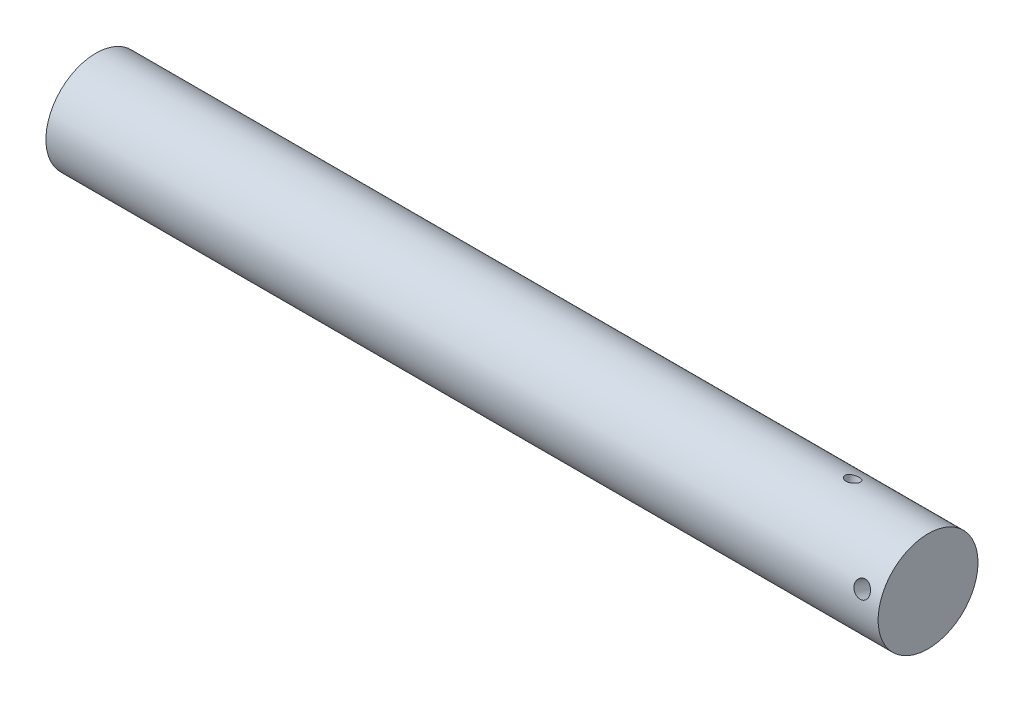
ISO-10303-21;
HEADER;
FILE_DESCRIPTION(('STEP AP214'),'2;1');
FILE_NAME('part.step','',(''),(''),'','','');
FILE_SCHEMA(('AUTOMOTIVE_DESIGN { 1 0 10303 214 1 1 1 1 }'));
ENDSEC;
DATA;
#1=APPLICATION_CONTEXT('core data for automotive mechanical design processes');
#2=APPLICATION_PROTOCOL_DEFINITION('international standard','automotive_design',2000,#1);
#3=PRODUCT_CONTEXT('',#1,'mechanical');
#4=PRODUCT('Part','Part','',(#3));
#5=PRODUCT_RELATED_PRODUCT_CATEGORY('part','',(#4));
#6=PRODUCT_DEFINITION_FORMATION('','',#4);
#7=PRODUCT_DEFINITION_CONTEXT('part definition',#1,'design');
#8=PRODUCT_DEFINITION('design','',#6,#7);
#9=PRODUCT_DEFINITION_SHAPE('','',#8);
#10=(LENGTH_UNIT() NAMED_UNIT(*) SI_UNIT(.MILLI.,.METRE.));
#11=(NAMED_UNIT(*) PLANE_ANGLE_UNIT() SI_UNIT($,.RADIAN.));
#12=(NAMED_UNIT(*) SI_UNIT($,.STERADIAN.) SOLID_ANGLE_UNIT());
#13=UNCERTAINTY_MEASURE_WITH_UNIT(LENGTH_MEASURE(1.E-05),#10,'distance_accuracy_value','');
#14=(GEOMETRIC_REPRESENTATION_CONTEXT(3) GLOBAL_UNCERTAINTY_ASSIGNED_CONTEXT((#13)) GLOBAL_UNIT_ASSIGNED_CONTEXT((#10,
#11,#12)) REPRESENTATION_CONTEXT('',''));
#15=CARTESIAN_POINT('',(0.,0.,0.));
#16=DIRECTION('',(0.,0.,1.));
#17=DIRECTION('',(1.,0.,0.));
#18=AXIS2_PLACEMENT_3D('',#15,#16,#17);
#19=CARTESIAN_POINT('',(125.,0.,0.));
#20=DIRECTION('',(-1.,0.,0.));
#21=DIRECTION('',(0.,0.,1.));
#22=AXIS2_PLACEMENT_3D('',#19,#20,#21);
#23=CYLINDRICAL_SURFACE('',#22,7.5);
#24=CARTESIAN_POINT('',(112.009618943233,-7.02552221836466,2.62526904511986));
#25=CARTESIAN_POINT('',(112.065520870964,-7.02552356947253,2.62526693540636));
#26=CARTESIAN_POINT('',(112.12145695978,-7.02718796542101,2.6208245782744));
#27=CARTESIAN_POINT('',(112.23177017439,-7.03374925218367,2.60316284386426));
#28=CARTESIAN_POINT('',(112.28614564569,-7.03864945029205,2.58993448638676));
#29=CARTESIAN_POINT('',(112.39172462735,-7.05138188389406,2.55506473660845));
#30=CARTESIAN_POINT('',(112.442930349043,-7.05921204784794,2.53342928786123));
#31=CARTESIAN_POINT('',(112.540774481087,-7.0773455533345,2.48231982767184));
#32=CARTESIAN_POINT('',(112.587413622702,-7.08764849797638,2.45284707406535));
#33=CARTESIAN_POINT('',(112.675105670568,-7.11021832316173,2.38663406841461));
#34=CARTESIAN_POINT('',(112.716125376073,-7.12249601626738,2.34985352611347));
#35=CARTESIAN_POINT('',(112.791127065962,-7.14832013832273,2.27008221844144));
#36=CARTESIAN_POINT('',(112.825108688971,-7.16186663236768,2.2270911343801));
#37=CARTESIAN_POINT('',(112.885189864092,-7.18960542180866,2.13584937449103));
#38=CARTESIAN_POINT('',(112.911259187879,-7.20379996134059,2.08757946287503));
#39=CARTESIAN_POINT('',(112.954582025324,-7.2321286663056,1.98721680913991));
#40=CARTESIAN_POINT('',(112.971835909422,-7.24626283425084,1.93512422776123));
#41=CARTESIAN_POINT('',(112.996938398024,-7.27380087891752,1.82888293084838));
#42=CARTESIAN_POINT('',(113.004842350739,-7.28720860034206,1.7747482928307));
#43=CARTESIAN_POINT('',(113.011192247602,-7.31291253438508,1.66566779412532));
#44=CARTESIAN_POINT('',(113.009638612102,-7.32520879637899,1.61072196960001));
#45=CARTESIAN_POINT('',(112.997161577963,-7.34827968836436,1.50195144663563));
#46=CARTESIAN_POINT('',(112.986297710861,-7.35906348067012,1.44812184591167));
#47=CARTESIAN_POINT('',(112.955601779723,-7.37901377963603,1.3427702461798));
#48=CARTESIAN_POINT('',(112.935769525649,-7.38818025201987,1.29124829609581));
#49=CARTESIAN_POINT('',(112.887637222672,-7.40486791474347,1.19183969599047));
#50=CARTESIAN_POINT('',(112.859311631642,-7.4123840221135,1.143964565533));
#51=CARTESIAN_POINT('',(112.795015314592,-7.42579591910018,1.05340113768405));
#52=CARTESIAN_POINT('',(112.75904418992,-7.43169162418909,1.01071311094089));
#53=CARTESIAN_POINT('',(112.680145019054,-7.4420429582459,0.931455708003939));
#54=CARTESIAN_POINT('',(112.637165059137,-7.4464870346691,0.894936482860358));
#55=CARTESIAN_POINT('',(112.545645977547,-7.45405814853691,0.829520894359403));
#56=CARTESIAN_POINT('',(112.497106833832,-7.457185180759,0.800624561229554));
#57=CARTESIAN_POINT('',(112.39579894306,-7.46231291816655,0.751334355624638));
#58=CARTESIAN_POINT('',(112.343027990974,-7.4643130317453,0.730944950548513));
#59=CARTESIAN_POINT('',(112.234779932914,-7.46734037570035,0.699344015170887));
#60=CARTESIAN_POINT('',(112.17930297622,-7.46836765968028,0.688131979194308));
#61=CARTESIAN_POINT('',(112.067673275731,-7.46953877038617,0.675301729632604));
#62=CARTESIAN_POINT('',(112.011528978067,-7.46968931233832,0.673610595983552));
#63=CARTESIAN_POINT('',(111.899759315181,-7.4691392877154,0.679681709853656));
#64=CARTESIAN_POINT('',(111.844133937364,-7.46843874185209,0.687443727324551));
#65=CARTESIAN_POINT('',(111.735200950031,-7.46612594429184,0.712119652047882));
#66=CARTESIAN_POINT('',(111.681885196724,-7.46451723485037,0.728997990463441));
#67=CARTESIAN_POINT('',(111.578829486507,-7.46025932779922,0.771350155379572));
#68=CARTESIAN_POINT('',(111.529089671572,-7.45761008890443,0.796824322931501));
#69=CARTESIAN_POINT('',(111.434270288013,-7.4510768808594,0.855765411222552));
#70=CARTESIAN_POINT('',(111.389220419049,-7.44718561070376,0.889279294704683));
#71=CARTESIAN_POINT('',(111.305363474015,-7.43798393611729,0.963212962765682));
#72=CARTESIAN_POINT('',(111.266556675159,-7.43267346869675,1.0036330538413));
#73=CARTESIAN_POINT('',(111.196030666273,-7.42043064233704,1.09047732995043));
#74=CARTESIAN_POINT('',(111.164359285048,-7.41348794095144,1.13693892034527));
#75=CARTESIAN_POINT('',(111.109334802146,-7.39790168985616,1.23429223784641));
#76=CARTESIAN_POINT('',(111.085981513355,-7.38925817841264,1.28518386526789));
#77=CARTESIAN_POINT('',(111.048334312439,-7.37030667977734,1.38974515008643));
#78=CARTESIAN_POINT('',(111.034013228692,-7.36000380300391,1.44340594492904));
#79=CARTESIAN_POINT('',(111.014748700503,-7.33785636844531,1.5520750483158));
#80=CARTESIAN_POINT('',(111.00980477188,-7.32601189029333,1.60708328713712));
#81=CARTESIAN_POINT('',(111.009444809613,-7.30116601035018,1.7164189086748));
#82=CARTESIAN_POINT('',(111.013955207936,-7.28817428950088,1.77074826366084));
#83=CARTESIAN_POINT('',(111.032219463849,-7.26137541750468,1.87762169064797));
#84=CARTESIAN_POINT('',(111.045973308494,-7.24756826749982,1.93016576514926));
#85=CARTESIAN_POINT('',(111.082309966772,-7.21967958588964,2.03199772805979));
#86=CARTESIAN_POINT('',(111.104888756437,-7.20559818211422,2.08128708858514));
#87=CARTESIAN_POINT('',(111.158226718056,-7.17776966930051,2.17532297721661));
#88=CARTESIAN_POINT('',(111.18898604106,-7.16402256644008,2.22006942141855));
#89=CARTESIAN_POINT('',(111.258082284235,-7.13741934589667,2.30417188333964));
#90=CARTESIAN_POINT('',(111.296473838303,-7.12457061181955,2.34348535410143));
#91=CARTESIAN_POINT('',(111.379630477757,-7.10054194180106,2.41531416246733));
#92=CARTESIAN_POINT('',(111.424397065194,-7.08936240042103,2.44782789348432));
#93=CARTESIAN_POINT('',(111.519260914019,-7.06924814382793,2.50532741403493));
#94=CARTESIAN_POINT('',(111.569380738988,-7.06032351056174,2.53027949025778));
#95=CARTESIAN_POINT('',(111.673343176992,-7.04531477296633,2.57177584366941));
#96=CARTESIAN_POINT('',(111.727181728113,-7.03922762391203,2.58832913475961));
#97=CARTESIAN_POINT('',(111.819343082596,-7.03169531674179,2.60870353983615));
#98=CARTESIAN_POINT('',(111.857088079717,-7.02938689253783,2.61490719940593));
#99=CARTESIAN_POINT('',(111.933089697969,-7.02629988781076,2.62319065545004));
#100=CARTESIAN_POINT('',(111.971346314433,-7.02552129334378,2.62527048951158));
#101=CARTESIAN_POINT('',(112.009618943233,-7.02552221836466,2.62526904511986));
#102=B_SPLINE_CURVE_WITH_KNOTS('',3,(#24,#25,#26,#27,#28,#29,#30,#31,#32,#33,#34,#35,#36,#37,
#38,#39,#40,#41,#42,#43,#44,#45,#46,#47,#48,#49,#50,#51,#52,#53,#54,#55,#56,#57,#58,#59,#60,#61,
#62,#63,#64,#65,#66,#67,#68,#69,#70,#71,#72,#73,#74,#75,#76,#77,#78,#79,#80,#81,#82,#83,#84,#85,
#86,#87,#88,#89,#90,#91,#92,#93,#94,#95,#96,#97,#98,#99,#100,#101),.UNSPECIFIED.,.T.,.F.,(4,2,2,
2,2,2,2,2,2,2,2,2,2,2,2,2,2,2,2,2,2,2,2,2,2,2,2,2,2,2,2,2,2,2,2,2,2,2,4),(0.,0.167565944619552,
0.335303423041822,0.502922531373102,0.67051475416376,0.839057975594798,1.00760984880016,
1.17679778261471,1.34597860627362,1.51415284761382,1.68231961431326,1.84941904333875,
2.01652201332238,2.18413264227024,2.35175201291213,2.52067457533378,2.68959780758443,
2.85860963826769,3.0276121557345,3.19531851289863,3.36302078890669,3.53007342408195,
3.69713268808003,3.86519264070065,4.03326005374209,4.2024225588115,4.37158125836474,
4.54022861884066,4.70886727109972,4.87619854927048,5.04352959309219,5.21078442673996,
5.37804234889437,5.54654371183371,5.715084842036,5.88436670989948,6.05346651155518,
6.16818970471025,6.28291185219903),.UNSPECIFIED.);
#103=CARTESIAN_POINT('',(112.009618943233,-7.02552221836466,2.62526904511986));
#104=VERTEX_POINT('',#103);
#105=EDGE_CURVE('E35',#104,#104,#102,.T.);
#106=ORIENTED_EDGE('',*,*,#105,.T.);
#107=EDGE_LOOP('',(#106));
#108=FACE_BOUND('',#107,.T.);
#109=CARTESIAN_POINT('',(112.009618943233,7.46954685246652,-0.675181322910747));
#110=CARTESIAN_POINT('',(111.953717015503,7.46954715699688,-0.675183809604297));
#111=CARTESIAN_POINT('',(111.897780926687,7.46912418894381,-0.67990883328543));
#112=CARTESIAN_POINT('',(111.787467712076,7.46739213802689,-0.698670159090852));
#113=CARTESIAN_POINT('',(111.733092240777,7.46608214850882,-0.712715988027464));
#114=CARTESIAN_POINT('',(111.627513259116,7.46246280103809,-0.74966073919617));
#115=CARTESIAN_POINT('',(111.576307537424,7.46015414897872,-0.772553406924217));
#116=CARTESIAN_POINT('',(111.47846340538,7.45437256450153,-0.82647533403198));
#117=CARTESIAN_POINT('',(111.431824263765,7.45089981888976,-0.85750328774083));
#118=CARTESIAN_POINT('',(111.344132215899,7.44257824468882,-0.926960544590068));
#119=CARTESIAN_POINT('',(111.303112510394,7.43772171936636,-0.965430847445059));
#120=CARTESIAN_POINT('',(111.228110820505,7.42646365826135,-1.04851876995965));
#121=CARTESIAN_POINT('',(111.194129197495,7.42006204318207,-1.0931367050761));
#122=CARTESIAN_POINT('',(111.134048022375,7.40556384592879,-1.18739327759872));
#123=CARTESIAN_POINT('',(111.107978698588,7.39746095865676,-1.23705022613361));
#124=CARTESIAN_POINT('',(111.064655861143,7.37954569203472,-1.33978396456267));
#125=CARTESIAN_POINT('',(111.047401977045,7.36973338454073,-1.39286061064965));
#126=CARTESIAN_POINT('',(111.022299488443,7.34856027975742,-1.50055117062415));
#127=CARTESIAN_POINT('',(111.014395535727,7.3372090429336,-1.55515405928101));
#128=CARTESIAN_POINT('',(111.008045638865,7.31315341826052,-1.66460986928985));
#129=CARTESIAN_POINT('',(111.009599274365,7.30044909057559,-1.71946277942106));
#130=CARTESIAN_POINT('',(111.022076308504,7.27415418831446,-1.82749921234081));
#131=CARTESIAN_POINT('',(111.032940175606,7.26056975042902,-1.88069112091656));
#132=CARTESIAN_POINT('',(111.063636106744,7.23294208046257,-1.9842946239805));
#133=CARTESIAN_POINT('',(111.083468360817,7.21889883866548,-2.03470615952791));
#134=CARTESIAN_POINT('',(111.131600663794,7.1909031426932,-2.13153998042283));
#135=CARTESIAN_POINT('',(111.159926254825,7.17695109394227,-2.17794968115414));
#136=CARTESIAN_POINT('',(111.224222571875,7.14983201351875,-2.26539205601619));
#137=CARTESIAN_POINT('',(111.260193696547,7.13666502282651,-2.30642444958311));
#138=CARTESIAN_POINT('',(111.339092867413,7.11168195644076,-2.38235028465281));
#139=CARTESIAN_POINT('',(111.38207282733,7.09987717961104,-2.41719351734358));
#140=CARTESIAN_POINT('',(111.47359190892,7.07838068769002,-2.47943837110046));
#141=CARTESIAN_POINT('',(111.522131052635,7.06868898097784,-2.50683996265778));
#142=CARTESIAN_POINT('',(111.623438943407,7.05197135766039,-2.55349121269582));
#143=CARTESIAN_POINT('',(111.676209895493,7.04494684189966,-2.57273658803675));
#144=CARTESIAN_POINT('',(111.784457953553,7.03399433413782,-2.60253300563837));
#145=CARTESIAN_POINT('',(111.839934910247,7.03006617152739,-2.61308452693255));
#146=CARTESIAN_POINT('',(111.951564610736,7.02556706231403,-2.62515700888065));
#147=CARTESIAN_POINT('',(112.0077089084,7.02497059869016,-2.62674660852953));
#148=CARTESIAN_POINT('',(112.119478571286,7.02710324415969,-2.62103584903443));
#149=CARTESIAN_POINT('',(112.175103949103,7.02983227232519,-2.61373570622781));
#150=CARTESIAN_POINT('',(112.284036936436,7.0384307489509,-2.59049099729818));
#151=CARTESIAN_POINT('',(112.337352689742,7.04428799117828,-2.57458002727034));
#152=CARTESIAN_POINT('',(112.44040839996,7.05878591832455,-2.53455946063266));
#153=CARTESIAN_POINT('',(112.490148214895,7.06742671368411,-2.51044953871782));
#154=CARTESIAN_POINT('',(112.584967598454,7.08705570303375,-2.45449029039009));
#155=CARTESIAN_POINT('',(112.630017467418,7.09805764795779,-2.42259546984871));
#156=CARTESIAN_POINT('',(112.713874412452,7.12177216522789,-2.35196629911314));
#157=CARTESIAN_POINT('',(112.752681211307,7.13448481348947,-2.31323164536532));
#158=CARTESIAN_POINT('',(112.823207220194,7.16104753625159,-2.22964793373647));
#159=CARTESIAN_POINT('',(112.854878601419,7.17490448226091,-2.18476068018));
#160=CARTESIAN_POINT('',(112.909903084321,7.20300319264194,-2.09025638331152));
#161=CARTESIAN_POINT('',(112.933256373111,7.21724494834968,-2.04063944642459));
#162=CARTESIAN_POINT('',(112.970903574027,7.24543079627136,-1.93818077397386));
#163=CARTESIAN_POINT('',(112.985224657775,7.25937565813873,-1.8853492398257));
#164=CARTESIAN_POINT('',(113.004489185964,7.28645907542809,-1.77780403353393));
#165=CARTESIAN_POINT('',(113.009433114587,7.29959767244706,-1.72309045871661));
#166=CARTESIAN_POINT('',(113.009793076854,7.32453721892855,-1.61377616455306));
#167=CARTESIAN_POINT('',(113.005282678531,7.33634774887731,-1.55917785866217));
#168=CARTESIAN_POINT('',(112.987018422617,7.35846083607718,-1.45123750332306));
#169=CARTESIAN_POINT('',(112.973264577973,7.3687633954402,-1.39789545211554));
#170=CARTESIAN_POINT('',(112.936927919695,7.38771143622979,-1.29402775269748));
#171=CARTESIAN_POINT('',(112.914349130029,7.39635767022803,-1.24350083283359));
#172=CARTESIAN_POINT('',(112.861011168411,7.41198468880285,-1.14668672866175));
#173=CARTESIAN_POINT('',(112.830251845407,7.4189654426225,-1.10039962266146));
#174=CARTESIAN_POINT('',(112.761155602232,7.43139635299305,-1.013070200862));
#175=CARTESIAN_POINT('',(112.722764048164,7.43683474485342,-0.972069434470431));
#176=CARTESIAN_POINT('',(112.63960740871,7.44627261084255,-0.896918377394076));
#177=CARTESIAN_POINT('',(112.594840821273,7.45027174507578,-0.862769705743512));
#178=CARTESIAN_POINT('',(112.499976972448,7.45703437384413,-0.80223009033356));
#179=CARTESIAN_POINT('',(112.449857147478,7.45979236049998,-0.775873901375876));
#180=CARTESIAN_POINT('',(112.345894709475,7.4642287445353,-0.731970279118003));
#181=CARTESIAN_POINT('',(112.292056158354,7.46590829984545,-0.714413402303315));
#182=CARTESIAN_POINT('',(112.199894803871,7.46793948563065,-0.692786421056829));
#183=CARTESIAN_POINT('',(112.16214980675,7.46854445748043,-0.686194894418478));
#184=CARTESIAN_POINT('',(112.086148188498,7.46934803479979,-0.677391514061398));
#185=CARTESIAN_POINT('',(112.047891572034,7.46954664397322,-0.675179620423856));
#186=CARTESIAN_POINT('',(112.009618943233,7.46954685246652,-0.675181322910747));
#187=B_SPLINE_CURVE_WITH_KNOTS('',3,(#109,#110,#111,#112,#113,#114,#115,#116,#117,#118,#119,
#120,#121,#122,#123,#124,#125,#126,#127,#128,#129,#130,#131,#132,#133,#134,#135,#136,#137,#138,
#139,#140,#141,#142,#143,#144,#145,#146,#147,#148,#149,#150,#151,#152,#153,#154,#155,#156,#157,
#158,#159,#160,#161,#162,#163,#164,#165,#166,#167,#168,#169,#170,#171,#172,#173,#174,#175,#176,
#177,#178,#179,#180,#181,#182,#183,#184,#185,#186),.UNSPECIFIED.,.T.,.F.,(4,2,2,2,2,2,2,2,2,2,2,
2,2,2,2,2,2,2,2,2,2,2,2,2,2,2,2,2,2,2,2,2,2,2,2,2,2,2,4),(0.,0.167565944619552,
0.335303423041822,0.502922531373099,0.670514754163762,0.839057975594799,1.00760984880016,
1.17679778261471,1.34597860627362,1.51415284761383,1.68231961431326,1.84941904333875,
2.01652201332238,2.18413264227024,2.35175201291213,2.52067457533378,2.68959780758443,
2.85860963826769,3.02761215573451,3.19531851289863,3.36302078890669,3.53007342408195,
3.69713268808004,3.86519264070066,4.03326005374209,4.2024225588115,4.37158125836474,
4.54022861884066,4.70886727109972,4.87619854927049,5.04352959309219,5.21078442673996,
5.37804234889438,5.54654371183371,5.715084842036,5.88436670989948,6.05346651155518,
6.16818970471026,6.28291185219903),.UNSPECIFIED.);
#188=CARTESIAN_POINT('',(112.009618943233,7.46954685246652,-0.675181322910747));
#189=VERTEX_POINT('',#188);
#190=EDGE_CURVE('E10',#189,#189,#187,.T.);
#191=ORIENTED_EDGE('',*,*,#190,.T.);
#192=EDGE_LOOP('',(#191));
#193=FACE_BOUND('',#192,.T.);
#194=CARTESIAN_POINT('',(122.197095895973,3.51335032442327,6.62618815744579));
#195=CARTESIAN_POINT('',(122.26352015471,3.51334813526074,6.62619012687177));
#196=CARTESIAN_POINT('',(122.329981803081,3.50836153272444,6.6288407612117));
#197=CARTESIAN_POINT('',(122.461043525227,3.48852964538728,6.63929828979605));
#198=CARTESIAN_POINT('',(122.525641773319,3.47367501318495,6.64711007285346));
#199=CARTESIAN_POINT('',(122.651060810878,3.4344936718587,6.66743856478263));
#200=CARTESIAN_POINT('',(122.711884586016,3.41017456294396,6.67995149823575));
#201=CARTESIAN_POINT('',(122.828121878438,3.35266460785247,6.70899940733286));
#202=CARTESIAN_POINT('',(122.883536069514,3.31947486848798,6.72553388117538));
#203=CARTESIAN_POINT('',(122.987884898245,3.24471471357652,6.76192010993685));
#204=CARTESIAN_POINT('',(123.03676407553,3.20307929425614,6.78179737698481));
#205=CARTESIAN_POINT('',(123.126174196815,3.1125964566457,6.8237985236622));
#206=CARTESIAN_POINT('',(123.166704663727,3.06374862647446,6.84592253157435));
#207=CARTESIAN_POINT('',(123.238473328537,2.95975877682916,6.89152113898285));
#208=CARTESIAN_POINT('',(123.269660169591,2.90458419507704,6.91500238616342));
#209=CARTESIAN_POINT('',(123.321526459439,2.78958691170053,6.96218808627186));
#210=CARTESIAN_POINT('',(123.34220652882,2.72976448484358,6.98589252593252));
#211=CARTESIAN_POINT('',(123.372303332664,2.60761811391433,7.03239365071206));
#212=CARTESIAN_POINT('',(123.381813108594,2.54531936789105,7.05519628318344));
#213=CARTESIAN_POINT('',(123.389588493129,2.41951098946641,7.09932453254417));
#214=CARTESIAN_POINT('',(123.387854798171,2.3560014323074,7.12065024083363));
#215=CARTESIAN_POINT('',(123.373265435478,2.23018689224492,7.16104703113055));
#216=CARTESIAN_POINT('',(123.360509882289,2.16787621313576,7.18013665665118));
#217=CARTESIAN_POINT('',(123.324396288809,2.0456832077163,7.21590158335157));
#218=CARTESIAN_POINT('',(123.301037949527,1.98580094993781,7.23257681642951));
#219=CARTESIAN_POINT('',(123.244280888892,1.86996669048675,7.26339007091082));
#220=CARTESIAN_POINT('',(123.210840479845,1.81403222075159,7.2775171608747));
#221=CARTESIAN_POINT('',(123.134899019389,1.7080131849392,7.30312741206416));
#222=CARTESIAN_POINT('',(123.092397301252,1.65792904974726,7.31461037860678));
#223=CARTESIAN_POINT('',(122.998983216282,1.56459188785122,7.33514590552833));
#224=CARTESIAN_POINT('',(122.947983391608,1.52142015204736,7.34417031206035));
#225=CARTESIAN_POINT('',(122.839316665571,1.44393443088307,7.3597975946247));
#226=CARTESIAN_POINT('',(122.781649713241,1.40962051324347,7.36640045214367));
#227=CARTESIAN_POINT('',(122.661190848925,1.35094231752057,7.37738782857748));
#228=CARTESIAN_POINT('',(122.598394140289,1.32658748259506,7.38177024301478));
#229=CARTESIAN_POINT('',(122.469510467209,1.28871155147773,7.38847724884796));
#230=CARTESIAN_POINT('',(122.403423764524,1.27518959485786,7.39080200368006));
#231=CARTESIAN_POINT('',(122.270603667915,1.25954300826302,7.39348460805616));
#232=CARTESIAN_POINT('',(122.203885061599,1.25729635655211,7.39386351666228));
#233=CARTESIAN_POINT('',(122.071024270111,1.2639496488059,7.39272901141997));
#234=CARTESIAN_POINT('',(122.004882064902,1.27284920373617,7.39121566361669));
#235=CARTESIAN_POINT('',(121.875435408458,1.30139908302465,7.386241688652));
#236=CARTESIAN_POINT('',(121.812116982719,1.32098810807034,7.38279216141583));
#237=CARTESIAN_POINT('',(121.689673113878,1.37021470170494,7.37381406907651));
#238=CARTESIAN_POINT('',(121.630547900689,1.3998528207705,7.36828539007824));
#239=CARTESIAN_POINT('',(121.517622586759,1.46850927437511,7.3549105571312));
#240=CARTESIAN_POINT('',(121.463871390296,1.5076043135083,7.34704532598304));
#241=CARTESIAN_POINT('',(121.363724105516,1.59381554233838,7.32882585359204));
#242=CARTESIAN_POINT('',(121.317328485196,1.64093224201641,7.3184714540818));
#243=CARTESIAN_POINT('',(121.232766363707,1.74223424187413,7.29502178606286));
#244=CARTESIAN_POINT('',(121.194681175023,1.79648172803121,7.28190170768291));
#245=CARTESIAN_POINT('',(121.128389081136,1.91005042984926,7.25293985885248));
#246=CARTESIAN_POINT('',(121.100181879869,1.96937149337821,7.23709816999557));
#247=CARTESIAN_POINT('',(121.054574650152,2.09105235676325,7.20287960877406));
#248=CARTESIAN_POINT('',(121.037131143307,2.15339881948127,7.18451330706152));
#249=CARTESIAN_POINT('',(121.013406100666,2.27948774874259,7.14550820980938));
#250=CARTESIAN_POINT('',(121.007123735095,2.34323011115099,7.12486958332699));
#251=CARTESIAN_POINT('',(121.005921419886,2.46952897896147,7.08207767715693));
#252=CARTESIAN_POINT('',(121.010877415481,2.53209081926019,7.05994352582786));
#253=CARTESIAN_POINT('',(121.03174399515,2.65497646476779,7.01465533137367));
#254=CARTESIAN_POINT('',(121.047654531254,2.71530027977556,6.99150129271497));
#255=CARTESIAN_POINT('',(121.089932674679,2.83202549716337,6.94503976743786));
#256=CARTESIAN_POINT('',(121.116290683567,2.88843044418687,6.92173244092498));
#257=CARTESIAN_POINT('',(121.178702052335,2.99593668913553,6.87588414463918));
#258=CARTESIAN_POINT('',(121.214755802038,3.04703777370187,6.85334320572029));
#259=CARTESIAN_POINT('',(121.295979326466,3.1431884477055,6.80978600102189));
#260=CARTESIAN_POINT('',(121.341240323501,3.1881693063231,6.78878810502852));
#261=CARTESIAN_POINT('',(121.439401741632,3.27036324904257,6.74957801626134));
#262=CARTESIAN_POINT('',(121.492303950434,3.30757451040554,6.73136647743102));
#263=CARTESIAN_POINT('',(121.604643447582,3.37352962374896,6.69855711345776));
#264=CARTESIAN_POINT('',(121.66412011517,3.40221818490921,6.68398297933094));
#265=CARTESIAN_POINT('',(121.78762607489,3.4500708363968,6.65940996215977));
#266=CARTESIAN_POINT('',(121.85165065614,3.46924462261993,6.64940642234423));
#267=CARTESIAN_POINT('',(121.962802336405,3.49336218751041,6.63675682850545));
#268=CARTESIAN_POINT('',(122.009249616084,3.50084765187582,6.63280468079338));
#269=CARTESIAN_POINT('',(122.102823624329,3.51084245867506,6.62751966664207));
#270=CARTESIAN_POINT('',(122.149950342355,3.51335187821223,6.62618675961795));
#271=CARTESIAN_POINT('',(122.197095895973,3.51335032442327,6.62618815744579));
#272=B_SPLINE_CURVE_WITH_KNOTS('',3,(#194,#195,#196,#197,#198,#199,#200,#201,#202,#203,#204,
#205,#206,#207,#208,#209,#210,#211,#212,#213,#214,#215,#216,#217,#218,#219,#220,#221,#222,#223,
#224,#225,#226,#227,#228,#229,#230,#231,#232,#233,#234,#235,#236,#237,#238,#239,#240,#241,#242,
#243,#244,#245,#246,#247,#248,#249,#250,#251,#252,#253,#254,#255,#256,#257,#258,#259,#260,#261,
#262,#263,#264,#265,#266,#267,#268,#269,#270,#271),.UNSPECIFIED.,.T.,.F.,(4,2,2,2,2,2,2,2,2,2,2,
2,2,2,2,2,2,2,2,2,2,2,2,2,2,2,2,2,2,2,2,2,2,2,2,2,2,2,4),(0.,0.199100413384908,
0.398389692261897,0.597519266031813,0.796624005462441,0.997323675683483,1.19803481175331,
1.39982972038509,1.60161270853752,1.80170277809815,2.00178045391006,2.20005964860322,
2.39834443499062,2.59746061019211,2.79659144134236,2.99791493364526,3.19923996508456,
3.40075545182719,3.60225493111853,3.80156900156598,4.00087611557707,4.19905212350892,
4.39723898902608,4.59709066995106,4.79695506129612,4.9986950867793,5.2004290651753,
5.40134274055002,5.60224147836689,5.80093340219863,5.99962445598201,6.1981333873851,
6.39665030112729,6.59723927183755,6.79787524775599,6.99978576302339,7.20149009955857,
7.34280661317237,7.48412093708335),.UNSPECIFIED.);
#273=CARTESIAN_POINT('',(122.197095895973,3.51335032442327,6.62618815744579));
#274=VERTEX_POINT('',#273);
#275=EDGE_CURVE('E51',#274,#274,#272,.T.);
#276=ORIENTED_EDGE('',*,*,#275,.T.);
#277=EDGE_LOOP('',(#276));
#278=FACE_BOUND('',#277,.T.);
#279=CARTESIAN_POINT('',(122.197095895973,-1.25913061806409,-7.39355057375369));
#280=CARTESIAN_POINT('',(122.130671637237,-1.25913355414409,-7.39355079848793));
#281=CARTESIAN_POINT('',(122.064209988865,-1.26470168681305,-7.39260847909414));
#282=CARTESIAN_POINT('',(121.933148266719,-1.28679500715997,-7.38879418289499));
#283=CARTESIAN_POINT('',(121.868550018627,-1.3033305836261,-7.38592037647578));
#284=CARTESIAN_POINT('',(121.743130981068,-1.34677711238438,-7.37812138736858));
#285=CARTESIAN_POINT('',(121.682307205931,-1.37367973950823,-7.37319785044431));
#286=CARTESIAN_POINT('',(121.566069913508,-1.4369680736279,-7.36112462710104));
#287=CARTESIAN_POINT('',(121.510655722432,-1.47335259752801,-7.35397521839166));
#288=CARTESIAN_POINT('',(121.406306893701,-1.55478566353062,-7.33719147127482));
#289=CARTESIAN_POINT('',(121.357427716416,-1.59990127411715,-7.32753768607496));
#290=CARTESIAN_POINT('',(121.268017595131,-1.69721732336818,-7.30560992325191));
#291=CARTESIAN_POINT('',(121.22748712822,-1.74941816663731,-7.29333579597024));
#292=CARTESIAN_POINT('',(121.155718463409,-1.85963081164087,-7.2660174009192));
#293=CARTESIAN_POINT('',(121.124531622355,-1.91767246860787,-7.25095853319274));
#294=CARTESIAN_POINT('',(121.072665332507,-2.03757470499873,-7.21818172451388));
#295=CARTESIAN_POINT('',(121.051985263127,-2.09943505862771,-7.20046394069147));
#296=CARTESIAN_POINT('',(121.021888459282,-2.22458389531116,-7.1627829214148));
#297=CARTESIAN_POINT('',(121.012378683352,-2.28785604237671,-7.14283977197914));
#298=CARTESIAN_POINT('',(121.004603298817,-2.41445857083509,-7.10104443418383));
#299=CARTESIAN_POINT('',(121.006336993775,-2.47778894837808,-7.07919236414819));
#300=CARTESIAN_POINT('',(121.020926356468,-2.60211971300326,-7.03443680443606));
#301=CARTESIAN_POINT('',(121.033681909657,-2.66313592703898,-7.01154453154082));
#302=CARTESIAN_POINT('',(121.069795503137,-2.78177132055521,-6.96532869052744));
#303=CARTESIAN_POINT('',(121.093153842419,-2.83939040418702,-6.94200511026449));
#304=CARTESIAN_POINT('',(121.149910903054,-2.94996659153533,-6.89574563441556));
#305=CARTESIAN_POINT('',(121.183351312102,-3.00290313505526,-6.87281177439234));
#306=CARTESIAN_POINT('',(121.259292772558,-3.10252818080974,-6.82841840575476));
#307=CARTESIAN_POINT('',(121.301794490694,-3.14921622287034,-6.80695900578431));
#308=CARTESIAN_POINT('',(121.395208575664,-3.23569712472289,-6.76628238754332));
#309=CARTESIAN_POINT('',(121.446208400338,-3.27540839984943,-6.74709246014905));
#310=CARTESIAN_POINT('',(121.554875126375,-3.346335459689,-6.71219831841708));
#311=CARTESIAN_POINT('',(121.612542078705,-3.37755117945089,-6.69649413072909));
#312=CARTESIAN_POINT('',(121.733000943021,-3.43074598862743,-6.66939864455768));
#313=CARTESIAN_POINT('',(121.795797651657,-3.45271631217012,-6.6580114401607));
#314=CARTESIAN_POINT('',(121.924681324737,-3.48681778469948,-6.64021650670816));
#315=CARTESIAN_POINT('',(121.990768027422,-3.4989497151257,-6.63380838217812));
#316=CARTESIAN_POINT('',(122.123588124031,-3.51298333749227,-6.62638750072234));
#317=CARTESIAN_POINT('',(122.190306730347,-3.51499455675469,-6.62531698088579));
#318=CARTESIAN_POINT('',(122.323167521835,-3.50903091742884,-6.62847742483411));
#319=CARTESIAN_POINT('',(122.389309727044,-3.50105640737106,-6.63270820358853));
#320=CARTESIAN_POINT('',(122.518756383488,-3.47540139504023,-6.64618619960579));
#321=CARTESIAN_POINT('',(122.582074809227,-3.45777623297508,-6.65540481135438));
#322=CARTESIAN_POINT('',(122.704518678068,-3.41329590660067,-6.67832563656956));
#323=CARTESIAN_POINT('',(122.763643891257,-3.38644023665476,-6.69202809565421));
#324=CARTESIAN_POINT('',(122.876569205187,-3.32388294004188,-6.72331993833584));
#325=CARTESIAN_POINT('',(122.93032040165,-3.28810890033719,-6.74094100609711));
#326=CARTESIAN_POINT('',(123.03046768643,-3.20868700398144,-6.77910496199603));
#327=CARTESIAN_POINT('',(123.07686330675,-3.1650386467061,-6.79964803588803));
#328=CARTESIAN_POINT('',(123.161425428239,-3.07046916296549,-6.84287528250869));
#329=CARTESIAN_POINT('',(123.199510616923,-3.01948362903975,-6.86557773923405));
#330=CARTESIAN_POINT('',(123.26580271081,-2.91183204328585,-6.91192183060487));
#331=CARTESIAN_POINT('',(123.294009912077,-2.85516616177507,-6.93556343707839));
#332=CARTESIAN_POINT('',(123.339617141795,-2.73788001397036,-6.9826920056895));
#333=CARTESIAN_POINT('',(123.357060648639,-2.67727676417814,-7.00617920574968));
#334=CARTESIAN_POINT('',(123.38078569128,-2.55357770168686,-7.05220482505779));
#335=CARTESIAN_POINT('',(123.387068056851,-2.49048207464021,-7.07474331471599));
#336=CARTESIAN_POINT('',(123.38827037206,-2.36430626037135,-7.11789670551518));
#337=CARTESIAN_POINT('',(123.383314376465,-2.30123351690601,-7.1385300171344));
#338=CARTESIAN_POINT('',(123.362447796796,-2.1762389831473,-7.17762309784165));
#339=CARTESIAN_POINT('',(123.346537260692,-2.11431718781526,-7.19608287644697));
#340=CARTESIAN_POINT('',(123.304259117267,-1.9934877316392,-7.23048770496713));
#341=CARTESIAN_POINT('',(123.277901108379,-1.9345773600319,-7.24643504440017));
#342=CARTESIAN_POINT('',(123.215489739611,-1.82142630835916,-7.27570103969548));
#343=CARTESIAN_POINT('',(123.179435989908,-1.76718581616421,-7.2890195898287));
#344=CARTESIAN_POINT('',(123.098212465481,-1.66442971286283,-7.31317254879456));
#345=CARTESIAN_POINT('',(123.052951468445,-1.61597976550529,-7.32397957795042));
#346=CARTESIAN_POINT('',(122.954790050314,-1.52693395506381,-7.34306147837262));
#347=CARTESIAN_POINT('',(122.901887841512,-1.48633993513477,-7.35133575566986));
#348=CARTESIAN_POINT('',(122.789548344365,-1.41406549292916,-7.36558132846786));
#349=CARTESIAN_POINT('',(122.730071676776,-1.38244333239083,-7.37153766038272));
#350=CARTESIAN_POINT('',(122.606565717056,-1.32953678179958,-7.38126423901154));
#351=CARTESIAN_POINT('',(122.542541135806,-1.30824186841769,-7.38503671181187));
#352=CARTESIAN_POINT('',(122.431389455541,-1.28141554658695,-7.38972900523467));
#353=CARTESIAN_POINT('',(122.384942175862,-1.27307346513379,-7.3911647368714));
#354=CARTESIAN_POINT('',(122.291368167618,-1.26193000183592,-7.39307543393339));
#355=CARTESIAN_POINT('',(122.244241449591,-1.25912853413993,-7.3935504142454));
#356=CARTESIAN_POINT('',(122.197095895973,-1.25913061806409,-7.39355057375369));
#357=B_SPLINE_CURVE_WITH_KNOTS('',3,(#279,#280,#281,#282,#283,#284,#285,#286,#287,#288,#289,
#290,#291,#292,#293,#294,#295,#296,#297,#298,#299,#300,#301,#302,#303,#304,#305,#306,#307,#308,
#309,#310,#311,#312,#313,#314,#315,#316,#317,#318,#319,#320,#321,#322,#323,#324,#325,#326,#327,
#328,#329,#330,#331,#332,#333,#334,#335,#336,#337,#338,#339,#340,#341,#342,#343,#344,#345,#346,
#347,#348,#349,#350,#351,#352,#353,#354,#355,#356),.UNSPECIFIED.,.T.,.F.,(4,2,2,2,2,2,2,2,2,2,2,
2,2,2,2,2,2,2,2,2,2,2,2,2,2,2,2,2,2,2,2,2,2,2,2,2,2,2,4),(0.,0.199100413384909,
0.398389692261897,0.597519266031813,0.796624005462441,0.997323675683503,1.19803481175331,
1.39982972038512,1.60161270853752,1.80170277809815,2.00178045391007,2.20005964860322,
2.39834443499063,2.59746061019211,2.79659144134237,2.99791493364526,3.19923996508457,
3.40075545182719,3.60225493111853,3.80156900156597,4.00087611557707,4.19905212350892,
4.39723898902608,4.59709066995108,4.79695506129613,4.99869508677933,5.2004290651753,
5.40134274055002,5.6022414783669,5.80093340219863,5.99962445598201,6.19813338738511,
6.39665030112729,6.59723927183755,6.797875247756,6.99978576302341,7.20149009955857,
7.34280661317238,7.48412093708336),.UNSPECIFIED.);
#358=CARTESIAN_POINT('',(122.197095895973,-1.25913061806409,-7.39355057375369));
#359=VERTEX_POINT('',#358);
#360=EDGE_CURVE('E42',#359,#359,#357,.T.);
#361=ORIENTED_EDGE('',*,*,#360,.T.);
#362=EDGE_LOOP('',(#361));
#363=FACE_BOUND('',#362,.T.);
#364=CARTESIAN_POINT('',(125.,0.,0.));
#365=DIRECTION('',(1.,0.,0.));
#366=DIRECTION('',(0.,0.,-1.));
#367=AXIS2_PLACEMENT_3D('',#364,#365,#366);
#368=CIRCLE('',#367,7.5);
#369=CARTESIAN_POINT('',(125.,0.,-7.5));
#370=VERTEX_POINT('',#369);
#371=EDGE_CURVE('E46',#370,#370,#368,.T.);
#372=ORIENTED_EDGE('',*,*,#371,.F.);
#373=EDGE_LOOP('',(#372));
#374=FACE_BOUND('',#373,.T.);
#375=CARTESIAN_POINT('',(0.,0.,0.));
#376=DIRECTION('',(1.,0.,0.));
#377=DIRECTION('',(0.,0.,-1.));
#378=AXIS2_PLACEMENT_3D('',#375,#376,#377);
#379=CIRCLE('',#378,7.5);
#380=CARTESIAN_POINT('',(0.,0.,-7.5));
#381=VERTEX_POINT('',#380);
#382=EDGE_CURVE('E71',#381,#381,#379,.T.);
#383=ORIENTED_EDGE('',*,*,#382,.T.);
#384=EDGE_LOOP('',(#383));
#385=FACE_BOUND('',#384,.T.);
#386=ADVANCED_FACE('F31',(#108,#193,#278,#363,#374,#385),#23,.T.);
#387=CARTESIAN_POINT('',(125.,0.,0.));
#388=DIRECTION('',(1.,0.,0.));
#389=DIRECTION('',(0.,0.,-1.));
#390=AXIS2_PLACEMENT_3D('',#387,#388,#389);
#391=PLANE('',#390);
#392=ORIENTED_EDGE('',*,*,#371,.T.);
#393=EDGE_LOOP('',(#392));
#394=FACE_BOUND('',#393,.T.);
#395=ADVANCED_FACE('F66',(#394),#391,.T.);
#396=CARTESIAN_POINT('',(0.,0.,0.));
#397=DIRECTION('',(1.,0.,0.));
#398=DIRECTION('',(0.,0.,-1.));
#399=AXIS2_PLACEMENT_3D('',#396,#397,#398);
#400=PLANE('',#399);
#401=ORIENTED_EDGE('',*,*,#382,.F.);
#402=EDGE_LOOP('',(#401));
#403=FACE_BOUND('',#402,.T.);
#404=ADVANCED_FACE('F64',(#403),#400,.F.);
#405=CARTESIAN_POINT('',(122.197095895973,-2.41688950018236,-7.09990458695807));
#406=DIRECTION('',(0.,-0.322251933357648,-0.946653944927743));
#407=DIRECTION('',(0.,0.946653944927743,-0.322251933357648));
#408=AXIS2_PLACEMENT_3D('',#405,#406,#407);
#409=CYLINDRICAL_SURFACE('',#408,1.190625);
#410=ORIENTED_EDGE('',*,*,#360,.F.);
#411=EDGE_LOOP('',(#410));
#412=FACE_BOUND('',#411,.T.);
#413=ORIENTED_EDGE('',*,*,#275,.F.);
#414=EDGE_LOOP('',(#413));
#415=FACE_BOUND('',#414,.T.);
#416=ADVANCED_FACE('F58',(#412,#415),#409,.F.);
#417=CARTESIAN_POINT('',(112.009618943233,7.31282895828416,-1.66509237788198));
#418=DIRECTION('',(0.,0.975043861104554,-0.222012317050931));
#419=DIRECTION('',(0.,0.222012317050931,0.975043861104554));
#420=AXIS2_PLACEMENT_3D('',#417,#418,#419);
#421=CYLINDRICAL_SURFACE('',#420,1.);
#422=ORIENTED_EDGE('',*,*,#190,.F.);
#423=EDGE_LOOP('',(#422));
#424=FACE_BOUND('',#423,.T.);
#425=ORIENTED_EDGE('',*,*,#105,.F.);
#426=EDGE_LOOP('',(#425));
#427=FACE_BOUND('',#426,.T.);
#428=ADVANCED_FACE('F55',(#424,#427),#421,.F.);
#429=CLOSED_SHELL('',(#386,#395,#404,#416,#428));
#430=MANIFOLD_SOLID_BREP('B2',#429);
#431=ADVANCED_BREP_SHAPE_REPRESENTATION('',(#18,#430),#14);
#432=SHAPE_DEFINITION_REPRESENTATION(#9,#431);
ENDSEC;
END-ISO-10303-21;
